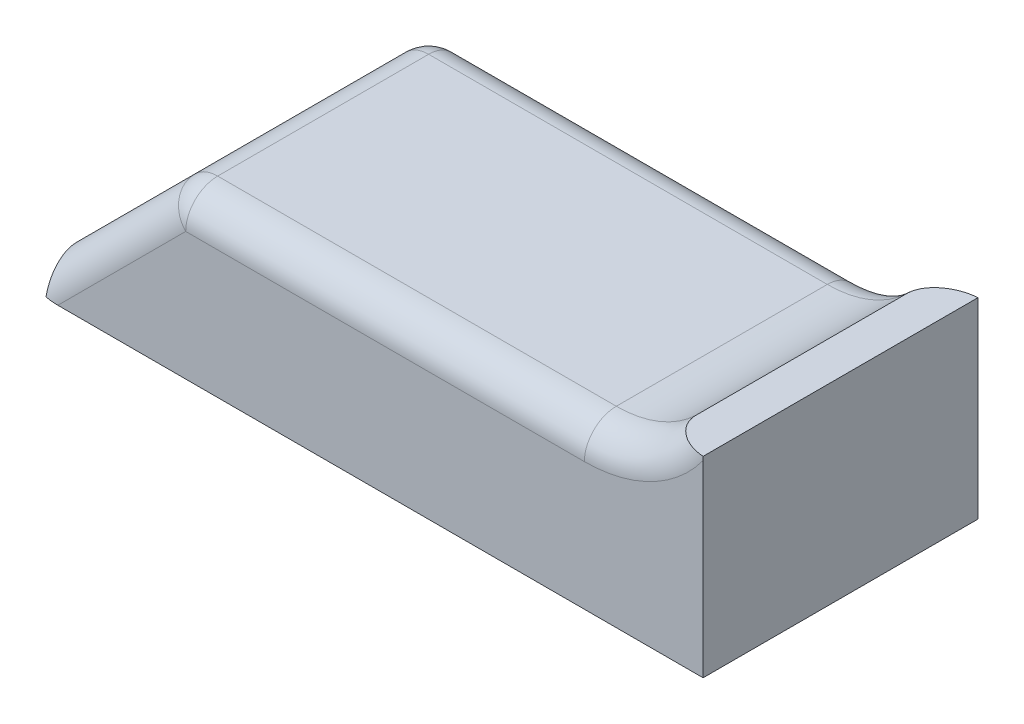
ISO-10303-21;
HEADER;
FILE_DESCRIPTION(('STEP AP214'),'2;1');
FILE_NAME('part.step','',(''),(''),'','','');
FILE_SCHEMA(('AUTOMOTIVE_DESIGN { 1 0 10303 214 1 1 1 1 }'));
ENDSEC;
DATA;
#1=APPLICATION_CONTEXT('core data for automotive mechanical design processes');
#2=APPLICATION_PROTOCOL_DEFINITION('international standard','automotive_design',2000,#1);
#3=PRODUCT_CONTEXT('',#1,'mechanical');
#4=PRODUCT('Part','Part','',(#3));
#5=PRODUCT_RELATED_PRODUCT_CATEGORY('part','',(#4));
#6=PRODUCT_DEFINITION_FORMATION('','',#4);
#7=PRODUCT_DEFINITION_CONTEXT('part definition',#1,'design');
#8=PRODUCT_DEFINITION('design','',#6,#7);
#9=PRODUCT_DEFINITION_SHAPE('','',#8);
#10=(LENGTH_UNIT() NAMED_UNIT(*) SI_UNIT(.MILLI.,.METRE.));
#11=(NAMED_UNIT(*) PLANE_ANGLE_UNIT() SI_UNIT($,.RADIAN.));
#12=(NAMED_UNIT(*) SI_UNIT($,.STERADIAN.) SOLID_ANGLE_UNIT());
#13=UNCERTAINTY_MEASURE_WITH_UNIT(LENGTH_MEASURE(1.E-05),#10,'distance_accuracy_value','');
#14=(GEOMETRIC_REPRESENTATION_CONTEXT(3) GLOBAL_UNCERTAINTY_ASSIGNED_CONTEXT((#13)) GLOBAL_UNIT_ASSIGNED_CONTEXT((#10,
#11,#12)) REPRESENTATION_CONTEXT('',''));
#15=CARTESIAN_POINT('',(0.,0.,0.));
#16=DIRECTION('',(0.,0.,1.));
#17=DIRECTION('',(1.,0.,0.));
#18=AXIS2_PLACEMENT_3D('',#15,#16,#17);
#19=CARTESIAN_POINT('',(0.,25.,0.));
#20=DIRECTION('',(0.,-1.,0.));
#21=DIRECTION('',(0.,0.,-1.));
#22=AXIS2_PLACEMENT_3D('',#19,#20,#21);
#23=PLANE('',#22);
#24=DIRECTION('',(0.,0.,-1.));
#25=VECTOR('',#24,1.);
#26=CARTESIAN_POINT('',(-29.4289321881345,25.,21.5));
#27=LINE('',#26,#25);
#28=CARTESIAN_POINT('',(-29.4289321881345,25.,-16.5));
#29=VERTEX_POINT('',#28);
#30=CARTESIAN_POINT('',(-29.4289321881345,25.,16.5));
#31=VERTEX_POINT('',#30);
#32=EDGE_CURVE('E323',#29,#31,#27,.F.);
#33=ORIENTED_EDGE('',*,*,#32,.T.);
#34=DIRECTION('',(1.,0.,0.));
#35=VECTOR('',#34,1.);
#36=CARTESIAN_POINT('',(0.,25.,16.5));
#37=LINE('',#36,#35);
#38=CARTESIAN_POINT('',(32.9266319976242,25.,16.5));
#39=VERTEX_POINT('',#38);
#40=EDGE_CURVE('E324',#31,#39,#37,.T.);
#41=ORIENTED_EDGE('',*,*,#40,.T.);
#42=DIRECTION('',(0.,0.,1.));
#43=VECTOR('',#42,1.);
#44=CARTESIAN_POINT('',(32.9266319976242,25.,0.));
#45=LINE('',#44,#43);
#46=CARTESIAN_POINT('',(32.9266319976242,25.,-16.5));
#47=VERTEX_POINT('',#46);
#48=EDGE_CURVE('E168',#39,#47,#45,.F.);
#49=ORIENTED_EDGE('',*,*,#48,.T.);
#50=DIRECTION('',(-1.,0.,0.));
#51=VECTOR('',#50,1.);
#52=CARTESIAN_POINT('',(0.,25.,-16.5));
#53=LINE('',#52,#51);
#54=EDGE_CURVE('E327',#47,#29,#53,.T.);
#55=ORIENTED_EDGE('',*,*,#54,.T.);
#56=EDGE_LOOP('',(#33,#41,#49,#55));
#57=FACE_BOUND('',#56,.T.);
#58=ADVANCED_FACE('F43',(#57),#23,.F.);
#59=CARTESIAN_POINT('',(-51.5,25.,-21.5));
#60=DIRECTION('',(1.,0.,0.));
#61=DIRECTION('',(0.,0.,-1.));
#62=AXIS2_PLACEMENT_3D('',#59,#60,#61);
#63=PLANE('',#62);
#64=DIRECTION('',(0.,0.,1.));
#65=VECTOR('',#64,1.);
#66=CARTESIAN_POINT('',(-51.5,0.,-21.5));
#67=LINE('',#66,#65);
#68=CARTESIAN_POINT('',(-51.5,0.,-21.2807257879246));
#69=VERTEX_POINT('',#68);
#70=CARTESIAN_POINT('',(-51.5,0.,21.2807257879246));
#71=VERTEX_POINT('',#70);
#72=EDGE_CURVE('E146',#69,#71,#67,.T.);
#73=ORIENTED_EDGE('',*,*,#72,.T.);
#74=CARTESIAN_POINT('',(-51.5,-2.07106781186554,16.5));
#75=DIRECTION('',(1.,0.,0.));
#76=DIRECTION('',(0.,-1.,0.));
#77=AXIS2_PLACEMENT_3D('',#74,#75,#76);
#78=ELLIPSE('',#77,7.07106781186549,5.);
#79=CARTESIAN_POINT('',(-51.5,4.99999999999993,16.5));
#80=VERTEX_POINT('',#79);
#81=EDGE_CURVE('E70',#71,#80,#78,.F.);
#82=ORIENTED_EDGE('',*,*,#81,.T.);
#83=DIRECTION('',(0.,0.,-1.));
#84=VECTOR('',#83,1.);
#85=CARTESIAN_POINT('',(-51.5,4.99999999999993,-21.5));
#86=LINE('',#85,#84);
#87=CARTESIAN_POINT('',(-51.5,4.99999999999993,-16.5));
#88=VERTEX_POINT('',#87);
#89=EDGE_CURVE('E158',#80,#88,#86,.T.);
#90=ORIENTED_EDGE('',*,*,#89,.T.);
#91=CARTESIAN_POINT('',(-51.5,-2.07106781186554,-16.5));
#92=DIRECTION('',(1.,0.,0.));
#93=DIRECTION('',(0.,1.,0.));
#94=AXIS2_PLACEMENT_3D('',#91,#92,#93);
#95=ELLIPSE('',#94,7.07106781186549,5.);
#96=EDGE_CURVE('E299',#88,#69,#95,.F.);
#97=ORIENTED_EDGE('',*,*,#96,.T.);
#98=EDGE_LOOP('',(#73,#82,#90,#97));
#99=FACE_BOUND('',#98,.T.);
#100=ADVANCED_FACE('F235',(#99),#63,.F.);
#101=CARTESIAN_POINT('',(51.5,25.,21.5));
#102=DIRECTION('',(0.,0.,-1.));
#103=DIRECTION('',(-1.,0.,0.));
#104=AXIS2_PLACEMENT_3D('',#101,#102,#103);
#105=PLANE('',#104);
#106=DIRECTION('',(1.,0.,0.));
#107=VECTOR('',#106,1.);
#108=CARTESIAN_POINT('',(51.5,20.,21.5));
#109=LINE('',#108,#107);
#110=CARTESIAN_POINT('',(32.9266319976242,20.,21.5));
#111=VERTEX_POINT('',#110);
#112=CARTESIAN_POINT('',(-29.4289321881345,20.,21.5));
#113=VERTEX_POINT('',#112);
#114=EDGE_CURVE('E171',#111,#113,#109,.F.);
#115=ORIENTED_EDGE('',*,*,#114,.T.);
#116=DIRECTION('',(0.707106781186546,0.707106781186549,0.));
#117=VECTOR('',#116,1.);
#118=CARTESIAN_POINT('',(-47.9644660940673,1.46446609406719,21.5));
#119=LINE('',#118,#117);
#120=CARTESIAN_POINT('',(-49.4289321881345,0.,21.5));
#121=VERTEX_POINT('',#120);
#122=EDGE_CURVE('E141',#113,#121,#119,.F.);
#123=ORIENTED_EDGE('',*,*,#122,.T.);
#124=DIRECTION('',(1.,0.,0.));
#125=VECTOR('',#124,1.);
#126=CARTESIAN_POINT('',(51.5,0.,21.5));
#127=LINE('',#126,#125);
#128=CARTESIAN_POINT('',(51.5,0.,21.5));
#129=VERTEX_POINT('',#128);
#130=EDGE_CURVE('E132',#121,#129,#127,.T.);
#131=ORIENTED_EDGE('',*,*,#130,.T.);
#132=DIRECTION('',(0.,-1.,0.));
#133=VECTOR('',#132,1.);
#134=CARTESIAN_POINT('',(51.5,25.,21.5));
#135=LINE('',#134,#133);
#136=CARTESIAN_POINT('',(51.5,29.4342342255101,21.5));
#137=VERTEX_POINT('',#136);
#138=EDGE_CURVE('E138',#137,#129,#135,.T.);
#139=ORIENTED_EDGE('',*,*,#138,.F.);
#140=CARTESIAN_POINT('',(32.9266319976242,43.,21.5));
#141=DIRECTION('',(0.,0.,-1.));
#142=DIRECTION('',(-1.,0.,0.));
#143=AXIS2_PLACEMENT_3D('',#140,#141,#142);
#144=CIRCLE('',#143,23.);
#145=EDGE_CURVE('E172',#137,#111,#144,.T.);
#146=ORIENTED_EDGE('',*,*,#145,.T.);
#147=EDGE_LOOP('',(#115,#123,#131,#139,#146));
#148=FACE_BOUND('',#147,.T.);
#149=ADVANCED_FACE('F139',(#148),#105,.F.);
#150=CARTESIAN_POINT('',(51.5,25.,-21.5));
#151=DIRECTION('',(-1.,0.,0.));
#152=DIRECTION('',(0.,0.,1.));
#153=AXIS2_PLACEMENT_3D('',#150,#151,#152);
#154=PLANE('',#153);
#155=DIRECTION('',(0.,0.,-1.));
#156=VECTOR('',#155,1.);
#157=CARTESIAN_POINT('',(51.5,30.,21.5));
#158=LINE('',#157,#156);
#159=CARTESIAN_POINT('',(51.5,30.,21.4891579881584));
#160=VERTEX_POINT('',#159);
#161=CARTESIAN_POINT('',(51.5,30.,-21.4891579881584));
#162=VERTEX_POINT('',#161);
#163=EDGE_CURVE('E314',#160,#162,#158,.T.);
#164=ORIENTED_EDGE('',*,*,#163,.F.);
#165=CARTESIAN_POINT('',(51.5,30.,21.4891579881584));
#166=CARTESIAN_POINT('',(51.5,29.9057399798548,21.4927472598727));
#167=CARTESIAN_POINT('',(51.5,29.8114628824993,21.4954453967008));
#168=CARTESIAN_POINT('',(51.5,29.6228742910905,21.4990594052273));
#169=CARTESIAN_POINT('',(51.5,29.5285627969493,21.4999752723464));
#170=CARTESIAN_POINT('',(51.5,29.4342342255101,21.5));
#171=B_SPLINE_CURVE_WITH_KNOTS('',3,(#165,#166,#167,#168,#169,#170),.UNSPECIFIED.,.F.,.F.,(4,2,
4),(0.,0.282947096208946,0.565894919415669),.UNSPECIFIED.);
#172=EDGE_CURVE('E160',#160,#137,#171,.T.);
#173=ORIENTED_EDGE('',*,*,#172,.T.);
#174=ORIENTED_EDGE('',*,*,#138,.T.);
#175=DIRECTION('',(0.,0.,-1.));
#176=VECTOR('',#175,1.);
#177=CARTESIAN_POINT('',(51.5,0.,-21.5));
#178=LINE('',#177,#176);
#179=CARTESIAN_POINT('',(51.5,0.,-21.5));
#180=VERTEX_POINT('',#179);
#181=EDGE_CURVE('E150',#129,#180,#178,.T.);
#182=ORIENTED_EDGE('',*,*,#181,.T.);
#183=DIRECTION('',(0.,-1.,0.));
#184=VECTOR('',#183,1.);
#185=CARTESIAN_POINT('',(51.5,25.,-21.5));
#186=LINE('',#185,#184);
#187=CARTESIAN_POINT('',(51.5,29.4342342255101,-21.5));
#188=VERTEX_POINT('',#187);
#189=EDGE_CURVE('E157',#188,#180,#186,.T.);
#190=ORIENTED_EDGE('',*,*,#189,.F.);
#191=CARTESIAN_POINT('',(51.5,29.4342342255101,-21.5));
#192=CARTESIAN_POINT('',(51.5,29.5285627969493,-21.4999752723464));
#193=CARTESIAN_POINT('',(51.5,29.6228742910905,-21.4990594052273));
#194=CARTESIAN_POINT('',(51.5,29.8114628824993,-21.4954453967008));
#195=CARTESIAN_POINT('',(51.5,29.9057399798548,-21.4927472598727));
#196=CARTESIAN_POINT('',(51.5,30.,-21.4891579881584));
#197=B_SPLINE_CURVE_WITH_KNOTS('',3,(#191,#192,#193,#194,#195,#196),.UNSPECIFIED.,.F.,.F.,(4,2,
4),(0.,0.282947823206724,0.565894919415669),.UNSPECIFIED.);
#198=EDGE_CURVE('E211',#188,#162,#197,.T.);
#199=ORIENTED_EDGE('',*,*,#198,.T.);
#200=EDGE_LOOP('',(#164,#173,#174,#182,#190,#199));
#201=FACE_BOUND('',#200,.T.);
#202=ADVANCED_FACE('F153',(#201),#154,.F.);
#203=CARTESIAN_POINT('',(51.5,25.,-21.5));
#204=DIRECTION('',(0.,0.,1.));
#205=DIRECTION('',(1.,0.,0.));
#206=AXIS2_PLACEMENT_3D('',#203,#204,#205);
#207=PLANE('',#206);
#208=DIRECTION('',(-1.,0.,0.));
#209=VECTOR('',#208,1.);
#210=CARTESIAN_POINT('',(51.5,0.,-21.5));
#211=LINE('',#210,#209);
#212=CARTESIAN_POINT('',(-49.4289321881345,0.,-21.5));
#213=VERTEX_POINT('',#212);
#214=EDGE_CURVE('E162',#180,#213,#211,.T.);
#215=ORIENTED_EDGE('',*,*,#214,.T.);
#216=DIRECTION('',(-0.707106781186546,-0.707106781186549,0.));
#217=VECTOR('',#216,1.);
#218=CARTESIAN_POINT('',(-32.9644660940672,16.4644660940673,-21.5));
#219=LINE('',#218,#217);
#220=CARTESIAN_POINT('',(-29.4289321881345,20.,-21.5));
#221=VERTEX_POINT('',#220);
#222=EDGE_CURVE('E11',#213,#221,#219,.F.);
#223=ORIENTED_EDGE('',*,*,#222,.T.);
#224=DIRECTION('',(-1.,0.,0.));
#225=VECTOR('',#224,1.);
#226=CARTESIAN_POINT('',(51.5,20.,-21.5));
#227=LINE('',#226,#225);
#228=CARTESIAN_POINT('',(32.9266319976242,20.,-21.5));
#229=VERTEX_POINT('',#228);
#230=EDGE_CURVE('E334',#221,#229,#227,.F.);
#231=ORIENTED_EDGE('',*,*,#230,.T.);
#232=CARTESIAN_POINT('',(32.9266319976242,43.,-21.5));
#233=DIRECTION('',(0.,0.,1.));
#234=DIRECTION('',(1.,0.,0.));
#235=AXIS2_PLACEMENT_3D('',#232,#233,#234);
#236=CIRCLE('',#235,23.);
#237=EDGE_CURVE('E335',#229,#188,#236,.T.);
#238=ORIENTED_EDGE('',*,*,#237,.T.);
#239=ORIENTED_EDGE('',*,*,#189,.T.);
#240=EDGE_LOOP('',(#215,#223,#231,#238,#239));
#241=FACE_BOUND('',#240,.T.);
#242=ADVANCED_FACE('F230',(#241),#207,.F.);
#243=CARTESIAN_POINT('',(0.,0.,0.));
#244=DIRECTION('',(0.,-1.,0.));
#245=DIRECTION('',(0.,0.,-1.));
#246=AXIS2_PLACEMENT_3D('',#243,#244,#245);
#247=PLANE('',#246);
#248=ORIENTED_EDGE('',*,*,#130,.F.);
#249=CARTESIAN_POINT('',(-49.4289321881345,0.,16.5));
#250=DIRECTION('',(0.,-1.,0.));
#251=DIRECTION('',(-1.,0.,0.));
#252=AXIS2_PLACEMENT_3D('',#249,#250,#251);
#253=ELLIPSE('',#252,7.07106781186546,5.);
#254=EDGE_CURVE('E300',#121,#71,#253,.T.);
#255=ORIENTED_EDGE('',*,*,#254,.T.);
#256=ORIENTED_EDGE('',*,*,#72,.F.);
#257=CARTESIAN_POINT('',(-49.4289321881345,0.,-16.5));
#258=DIRECTION('',(0.,-1.,0.));
#259=DIRECTION('',(1.,0.,0.));
#260=AXIS2_PLACEMENT_3D('',#257,#258,#259);
#261=ELLIPSE('',#260,7.07106781186546,5.);
#262=EDGE_CURVE('E276',#69,#213,#261,.T.);
#263=ORIENTED_EDGE('',*,*,#262,.T.);
#264=ORIENTED_EDGE('',*,*,#214,.F.);
#265=ORIENTED_EDGE('',*,*,#181,.F.);
#266=EDGE_LOOP('',(#248,#255,#256,#263,#264,#265));
#267=FACE_BOUND('',#266,.T.);
#268=ADVANCED_FACE('F161',(#267),#247,.T.);
#269=CARTESIAN_POINT('',(-31.5,25.,0.));
#270=DIRECTION('',(0.707106781186549,-0.707106781186546,0.));
#271=DIRECTION('',(0.,0.,1.));
#272=AXIS2_PLACEMENT_3D('',#269,#270,#271);
#273=PLANE('',#272);
#274=ORIENTED_EDGE('',*,*,#89,.F.);
#275=DIRECTION('',(-0.707106781186546,-0.707106781186549,0.));
#276=VECTOR('',#275,1.);
#277=CARTESIAN_POINT('',(-36.5,20.,16.5));
#278=LINE('',#277,#276);
#279=CARTESIAN_POINT('',(-32.9644660940673,23.5355339059327,16.5));
#280=VERTEX_POINT('',#279);
#281=EDGE_CURVE('E55',#80,#280,#278,.F.);
#282=ORIENTED_EDGE('',*,*,#281,.T.);
#283=DIRECTION('',(0.,0.,1.));
#284=VECTOR('',#283,1.);
#285=CARTESIAN_POINT('',(-32.9644660940673,23.5355339059327,-21.5));
#286=LINE('',#285,#284);
#287=CARTESIAN_POINT('',(-32.9644660940673,23.5355339059327,-16.5));
#288=VERTEX_POINT('',#287);
#289=EDGE_CURVE('E320',#280,#288,#286,.F.);
#290=ORIENTED_EDGE('',*,*,#289,.T.);
#291=DIRECTION('',(0.707106781186546,0.707106781186549,0.));
#292=VECTOR('',#291,1.);
#293=CARTESIAN_POINT('',(-51.5,4.99999999999991,-16.5));
#294=LINE('',#293,#292);
#295=EDGE_CURVE('E58',#288,#88,#294,.F.);
#296=ORIENTED_EDGE('',*,*,#295,.T.);
#297=EDGE_LOOP('',(#274,#282,#290,#296));
#298=FACE_BOUND('',#297,.T.);
#299=ADVANCED_FACE('F237',(#298),#273,.F.);
#300=CARTESIAN_POINT('',(0.,30.,0.));
#301=DIRECTION('',(0.,1.,0.));
#302=DIRECTION('',(0.,0.,1.));
#303=AXIS2_PLACEMENT_3D('',#300,#301,#302);
#304=PLANE('',#303);
#305=DIRECTION('',(0.,0.,1.));
#306=VECTOR('',#305,1.);
#307=CARTESIAN_POINT('',(45.3765315956129,30.,21.5));
#308=LINE('',#307,#306);
#309=CARTESIAN_POINT('',(45.3765315956129,30.,-16.5));
#310=VERTEX_POINT('',#309);
#311=CARTESIAN_POINT('',(45.3765315956129,30.,16.5));
#312=VERTEX_POINT('',#311);
#313=EDGE_CURVE('E458',#310,#312,#308,.T.);
#314=ORIENTED_EDGE('',*,*,#313,.T.);
#315=CARTESIAN_POINT('',(45.3765315956129,30.,16.5));
#316=CARTESIAN_POINT('',(45.3764793175411,30.,16.6134061847709));
#317=CARTESIAN_POINT('',(45.38210804955,30.,16.7267819813948));
#318=CARTESIAN_POINT('',(45.404321984002,30.,16.9523346318892));
#319=CARTESIAN_POINT('',(45.4208952028498,30.,17.0645126608854));
#320=CARTESIAN_POINT('',(45.4643700367629,30.,17.2856438974703));
#321=CARTESIAN_POINT('',(45.4911639543115,30.,17.3946183815912));
#322=CARTESIAN_POINT('',(45.5543991489936,30.,17.6097178190154));
#323=CARTESIAN_POINT('',(45.5908425473341,30.,17.715842140122));
#324=CARTESIAN_POINT('',(45.713137350681,30.,18.0280200965836));
#325=CARTESIAN_POINT('',(45.8121896447062,30.,18.2290161929387));
#326=CARTESIAN_POINT('',(46.0389972165031,30.,18.6143841805319));
#327=CARTESIAN_POINT('',(46.1668367949908,30.,18.7987049714408));
#328=CARTESIAN_POINT('',(46.5121077942566,30.,19.2335913084696));
#329=CARTESIAN_POINT('',(46.7430880986463,30.,19.4734836136231));
#330=CARTESIAN_POINT('',(47.1156158093794,30.,19.803135966972));
#331=CARTESIAN_POINT('',(47.2443331484583,30.,19.9081147962429));
#332=CARTESIAN_POINT('',(47.5093042878958,30.,20.1081617047338));
#333=CARTESIAN_POINT('',(47.6455578779214,30.,20.2032300603367));
#334=CARTESIAN_POINT('',(47.9621644387974,30.,20.4078436078213));
#335=CARTESIAN_POINT('',(48.1444815022262,30.,20.5143547494608));
#336=CARTESIAN_POINT('',(48.5175039972707,30.,20.7114328803978));
#337=CARTESIAN_POINT('',(48.7082121236523,30.,20.8019947002115));
#338=CARTESIAN_POINT('',(49.2902229317951,30.,21.0494256516608));
#339=CARTESIAN_POINT('',(49.6920661316307,30.,21.182456004743));
#340=CARTESIAN_POINT('',(50.3311640751279,30.,21.3380299410222));
#341=CARTESIAN_POINT('',(50.5631920618638,30.,21.3834382120554));
#342=CARTESIAN_POINT('',(51.029887709596,30.,21.4525947451447));
#343=CARTESIAN_POINT('',(51.2645478354005,30.,21.4763939480233));
#344=CARTESIAN_POINT('',(51.5,30.,21.4891579881584));
#345=B_SPLINE_CURVE_WITH_KNOTS('',3,(#315,#316,#317,#318,#319,#320,#321,#322,#323,#324,#325,
#326,#327,#328,#329,#330,#331,#332,#333,#334,#335,#336,#337,#338,#339,#340,#341,#342,#343,#344),
.UNSPECIFIED.,.F.,.F.,(4,2,2,2,2,2,2,2,2,2,2,2,2,2,4),(0.,0.340029807671386,0.679687917853081,
1.01586165960251,1.35210936253202,2.02116633618007,2.69220866195324,3.68537078065545,
4.18334823134932,4.68131179074924,5.31389171022003,5.94667628525116,7.20994765409705,
7.91839155323834,8.62516101060927),.UNSPECIFIED.);
#346=EDGE_CURVE('E189',#312,#160,#345,.T.);
#347=ORIENTED_EDGE('',*,*,#346,.T.);
#348=ORIENTED_EDGE('',*,*,#163,.T.);
#349=CARTESIAN_POINT('',(51.5,30.,-21.4891579881584));
#350=CARTESIAN_POINT('',(51.2889302240343,30.,-21.4777406962776));
#351=CARTESIAN_POINT('',(51.0783737975366,30.,-21.4574078637806));
#352=CARTESIAN_POINT('',(50.6596717728972,30.,-21.399412494096));
#353=CARTESIAN_POINT('',(50.4515260094364,30.,-21.3617511525684));
#354=CARTESIAN_POINT('',(50.0373498666069,30.,-21.2692298243104));
#355=CARTESIAN_POINT('',(49.8313497308049,30.,-21.214234661289));
#356=CARTESIAN_POINT('',(49.4245442175918,30.,-21.0875402880589));
#357=CARTESIAN_POINT('',(49.2237389762197,30.,-21.0158406408998));
#358=CARTESIAN_POINT('',(48.8246094610552,30.,-20.8543376370923));
#359=CARTESIAN_POINT('',(48.6264259351618,30.,-20.7641855942541));
#360=CARTESIAN_POINT('',(48.2386322723098,30.,-20.5668927416743));
#361=CARTESIAN_POINT('',(48.0490238366128,30.,-20.4597485796052));
#362=CARTESIAN_POINT('',(47.6809615283949,30.,-20.228818197794));
#363=CARTESIAN_POINT('',(47.5024760894918,30.,-20.1050825393861));
#364=CARTESIAN_POINT('',(47.1586449545068,30.,-19.840704129947));
#365=CARTESIAN_POINT('',(46.9932907364696,30.,-19.7000724955646));
#366=CARTESIAN_POINT('',(46.6435175516365,30.,-19.3682730075136));
#367=CARTESIAN_POINT('',(46.4630848863056,30.,-19.1728323621523));
#368=CARTESIAN_POINT('',(46.1342801944338,30.,-18.7566662992155));
#369=CARTESIAN_POINT('',(45.9858622064922,30.,-18.5359778348476));
#370=CARTESIAN_POINT('',(45.7551359166684,30.,-18.1151660504671));
#371=CARTESIAN_POINT('',(45.6656322445606,30.,-17.9190535015549));
#372=CARTESIAN_POINT('',(45.5566740937969,30.,-17.6161019106209));
#373=CARTESIAN_POINT('',(45.5245827750688,30.,-17.5137191583177));
#374=CARTESIAN_POINT('',(45.4694209920505,30.,-17.3065679580862));
#375=CARTESIAN_POINT('',(45.4463465040849,30.,-17.2018005964052));
#376=CARTESIAN_POINT('',(45.4110096390521,30.,-16.9978326255478));
#377=CARTESIAN_POINT('',(45.3981158382755,30.,-16.8987412171072));
#378=CARTESIAN_POINT('',(45.3808591688201,30.,-16.6997734498099));
#379=CARTESIAN_POINT('',(45.3765003512542,30.,-16.5998967407818));
#380=CARTESIAN_POINT('',(45.3765315956129,30.,-16.5));
#381=B_SPLINE_CURVE_WITH_KNOTS('',3,(#349,#350,#351,#352,#353,#354,#355,#356,#357,#358,#359,
#360,#361,#362,#363,#364,#365,#366,#367,#368,#369,#370,#371,#372,#373,#374,#375,#376,#377,#378,
#379,#380),.UNSPECIFIED.,.F.,.F.,(4,2,2,2,2,2,2,2,2,2,2,2,2,2,2,4),(0.,0.633902024751119,
1.26776031708144,1.90668937855341,2.5456351547996,3.19800420456236,3.85050211885849,
4.50105496562203,5.15118210359894,5.94646388734891,6.74059622351274,7.38445612881485,
7.7059953644552,8.02739095195588,8.32681018836514,8.62637150910088),.UNSPECIFIED.);
#382=EDGE_CURVE('E182',#162,#310,#381,.T.);
#383=ORIENTED_EDGE('',*,*,#382,.T.);
#384=EDGE_LOOP('',(#314,#347,#348,#383));
#385=FACE_BOUND('',#384,.T.);
#386=ADVANCED_FACE('F198',(#385),#304,.T.);
#387=CARTESIAN_POINT('',(32.9266319976242,43.,21.5));
#388=DIRECTION('',(0.,0.,1.));
#389=DIRECTION('',(1.,0.,0.));
#390=AXIS2_PLACEMENT_3D('',#387,#388,#389);
#391=CYLINDRICAL_SURFACE('',#390,18.);
#392=ORIENTED_EDGE('',*,*,#48,.F.);
#393=CARTESIAN_POINT('',(32.9266319976242,43.,16.5));
#394=DIRECTION('',(0.,0.,-1.));
#395=DIRECTION('',(-1.,0.,0.));
#396=AXIS2_PLACEMENT_3D('',#393,#394,#395);
#397=CIRCLE('',#396,18.);
#398=EDGE_CURVE('E176',#39,#312,#397,.F.);
#399=ORIENTED_EDGE('',*,*,#398,.T.);
#400=ORIENTED_EDGE('',*,*,#313,.F.);
#401=CARTESIAN_POINT('',(32.9266319976242,43.,-16.5));
#402=DIRECTION('',(0.,0.,1.));
#403=DIRECTION('',(1.,0.,0.));
#404=AXIS2_PLACEMENT_3D('',#401,#402,#403);
#405=CIRCLE('',#404,18.);
#406=EDGE_CURVE('E180',#310,#47,#405,.F.);
#407=ORIENTED_EDGE('',*,*,#406,.T.);
#408=EDGE_LOOP('',(#392,#399,#400,#407));
#409=FACE_BOUND('',#408,.T.);
#410=ADVANCED_FACE('F202',(#409),#391,.F.);
#411=CARTESIAN_POINT('',(32.9266319976242,43.,-16.5));
#412=DIRECTION('',(0.,0.,1.));
#413=DIRECTION('',(1.,0.,0.));
#414=AXIS2_PLACEMENT_3D('',#411,#412,#413);
#415=TOROIDAL_SURFACE('',#414,23.,5.);
#416=ORIENTED_EDGE('',*,*,#198,.F.);
#417=ORIENTED_EDGE('',*,*,#237,.F.);
#418=CARTESIAN_POINT('',(32.9266319976242,20.,-16.5));
#419=DIRECTION('',(-1.,0.,0.));
#420=DIRECTION('',(0.,0.,1.));
#421=AXIS2_PLACEMENT_3D('',#418,#419,#420);
#422=CIRCLE('',#421,5.);
#423=EDGE_CURVE('E306',#47,#229,#422,.T.);
#424=ORIENTED_EDGE('',*,*,#423,.F.);
#425=ORIENTED_EDGE('',*,*,#406,.F.);
#426=ORIENTED_EDGE('',*,*,#382,.F.);
#427=EDGE_LOOP('',(#416,#417,#424,#425,#426));
#428=FACE_BOUND('',#427,.T.);
#429=ADVANCED_FACE('F200',(#428),#415,.T.);
#430=CARTESIAN_POINT('',(0.,20.,-16.5));
#431=DIRECTION('',(-1.,0.,0.));
#432=DIRECTION('',(0.,0.,1.));
#433=AXIS2_PLACEMENT_3D('',#430,#431,#432);
#434=CYLINDRICAL_SURFACE('',#433,5.);
#435=ORIENTED_EDGE('',*,*,#230,.F.);
#436=CARTESIAN_POINT('',(-29.4289321881345,20.,-16.5));
#437=DIRECTION('',(-1.,0.,0.));
#438=DIRECTION('',(0.,0.,1.));
#439=AXIS2_PLACEMENT_3D('',#436,#437,#438);
#440=CIRCLE('',#439,5.);
#441=EDGE_CURVE('E282',#221,#29,#440,.F.);
#442=ORIENTED_EDGE('',*,*,#441,.T.);
#443=ORIENTED_EDGE('',*,*,#54,.F.);
#444=ORIENTED_EDGE('',*,*,#423,.T.);
#445=EDGE_LOOP('',(#435,#442,#443,#444));
#446=FACE_BOUND('',#445,.T.);
#447=ADVANCED_FACE('F204',(#446),#434,.T.);
#448=CARTESIAN_POINT('',(-29.4289321881345,20.,0.));
#449=DIRECTION('',(0.,0.,1.));
#450=DIRECTION('',(1.,0.,0.));
#451=AXIS2_PLACEMENT_3D('',#448,#449,#450);
#452=CYLINDRICAL_SURFACE('',#451,5.);
#453=ORIENTED_EDGE('',*,*,#289,.F.);
#454=CARTESIAN_POINT('',(-29.4289321881345,20.,16.5));
#455=DIRECTION('',(0.,0.,1.));
#456=DIRECTION('',(1.,0.,0.));
#457=AXIS2_PLACEMENT_3D('',#454,#455,#456);
#458=CIRCLE('',#457,5.);
#459=EDGE_CURVE('E288',#280,#31,#458,.F.);
#460=ORIENTED_EDGE('',*,*,#459,.T.);
#461=ORIENTED_EDGE('',*,*,#32,.F.);
#462=CARTESIAN_POINT('',(-29.4289321881345,20.,-16.5));
#463=DIRECTION('',(0.,0.,1.));
#464=DIRECTION('',(1.,0.,0.));
#465=AXIS2_PLACEMENT_3D('',#462,#463,#464);
#466=CIRCLE('',#465,5.);
#467=EDGE_CURVE('E290',#29,#288,#466,.T.);
#468=ORIENTED_EDGE('',*,*,#467,.T.);
#469=EDGE_LOOP('',(#453,#460,#461,#468));
#470=FACE_BOUND('',#469,.T.);
#471=ADVANCED_FACE('F252',(#470),#452,.T.);
#472=CARTESIAN_POINT('',(0.,20.,16.5));
#473=DIRECTION('',(1.,0.,0.));
#474=DIRECTION('',(0.,0.,-1.));
#475=AXIS2_PLACEMENT_3D('',#472,#473,#474);
#476=CYLINDRICAL_SURFACE('',#475,5.);
#477=ORIENTED_EDGE('',*,*,#40,.F.);
#478=CARTESIAN_POINT('',(-29.4289321881345,20.,16.5));
#479=DIRECTION('',(1.,0.,0.));
#480=DIRECTION('',(0.,0.,-1.));
#481=AXIS2_PLACEMENT_3D('',#478,#479,#480);
#482=CIRCLE('',#481,5.);
#483=EDGE_CURVE('E319',#31,#113,#482,.T.);
#484=ORIENTED_EDGE('',*,*,#483,.T.);
#485=ORIENTED_EDGE('',*,*,#114,.F.);
#486=CARTESIAN_POINT('',(32.9266319976242,20.,16.5));
#487=DIRECTION('',(1.,0.,0.));
#488=DIRECTION('',(0.,0.,-1.));
#489=AXIS2_PLACEMENT_3D('',#486,#487,#488);
#490=CIRCLE('',#489,5.);
#491=EDGE_CURVE('E304',#39,#111,#490,.T.);
#492=ORIENTED_EDGE('',*,*,#491,.F.);
#493=EDGE_LOOP('',(#477,#484,#485,#492));
#494=FACE_BOUND('',#493,.T.);
#495=ADVANCED_FACE('F249',(#494),#476,.T.);
#496=CARTESIAN_POINT('',(32.9266319976242,43.,16.5));
#497=DIRECTION('',(0.,0.,-1.));
#498=DIRECTION('',(-1.,0.,0.));
#499=AXIS2_PLACEMENT_3D('',#496,#497,#498);
#500=TOROIDAL_SURFACE('',#499,23.,5.);
#501=ORIENTED_EDGE('',*,*,#346,.F.);
#502=ORIENTED_EDGE('',*,*,#398,.F.);
#503=ORIENTED_EDGE('',*,*,#491,.T.);
#504=ORIENTED_EDGE('',*,*,#145,.F.);
#505=ORIENTED_EDGE('',*,*,#172,.F.);
#506=EDGE_LOOP('',(#501,#502,#503,#504,#505));
#507=FACE_BOUND('',#506,.T.);
#508=ADVANCED_FACE('F241',(#507),#500,.T.);
#509=CARTESIAN_POINT('',(13.5355339059326,62.9644660940673,16.5));
#510=DIRECTION('',(-0.707106781186546,-0.707106781186549,0.));
#511=DIRECTION('',(0.707106781186549,-0.707106781186546,0.));
#512=AXIS2_PLACEMENT_3D('',#509,#510,#511);
#513=CYLINDRICAL_SURFACE('',#512,5.);
#514=CARTESIAN_POINT('',(-29.4289321881345,20.,16.5));
#515=DIRECTION('',(0.707106781186546,0.707106781186549,0.));
#516=DIRECTION('',(-0.707106781186549,0.707106781186546,0.));
#517=AXIS2_PLACEMENT_3D('',#514,#515,#516);
#518=CIRCLE('',#517,5.);
#519=EDGE_CURVE('E284',#280,#113,#518,.T.);
#520=ORIENTED_EDGE('',*,*,#519,.F.);
#521=ORIENTED_EDGE('',*,*,#281,.F.);
#522=ORIENTED_EDGE('',*,*,#81,.F.);
#523=ORIENTED_EDGE('',*,*,#254,.F.);
#524=ORIENTED_EDGE('',*,*,#122,.F.);
#525=EDGE_LOOP('',(#520,#521,#522,#523,#524));
#526=FACE_BOUND('',#525,.T.);
#527=ADVANCED_FACE('F250',(#526),#513,.T.);
#528=CARTESIAN_POINT('',(-29.4289321881345,20.,16.5));
#529=DIRECTION('',(0.,0.,1.));
#530=DIRECTION('',(1.,0.,0.));
#531=AXIS2_PLACEMENT_3D('',#528,#529,#530);
#532=SPHERICAL_SURFACE('',#531,5.);
#533=ORIENTED_EDGE('',*,*,#483,.F.);
#534=ORIENTED_EDGE('',*,*,#459,.F.);
#535=ORIENTED_EDGE('',*,*,#519,.T.);
#536=EDGE_LOOP('',(#533,#534,#535));
#537=FACE_BOUND('',#536,.T.);
#538=ADVANCED_FACE('F208',(#537),#532,.T.);
#539=CARTESIAN_POINT('',(13.5355339059326,62.9644660940673,-16.5));
#540=DIRECTION('',(0.707106781186546,0.707106781186549,0.));
#541=DIRECTION('',(-0.707106781186549,0.707106781186546,0.));
#542=AXIS2_PLACEMENT_3D('',#539,#540,#541);
#543=CYLINDRICAL_SURFACE('',#542,5.);
#544=CARTESIAN_POINT('',(-29.4289321881345,20.,-16.5));
#545=DIRECTION('',(0.707106781186546,0.707106781186549,0.));
#546=DIRECTION('',(-0.707106781186549,0.707106781186546,0.));
#547=AXIS2_PLACEMENT_3D('',#544,#545,#546);
#548=CIRCLE('',#547,5.);
#549=EDGE_CURVE('E50',#221,#288,#548,.T.);
#550=ORIENTED_EDGE('',*,*,#549,.F.);
#551=ORIENTED_EDGE('',*,*,#222,.F.);
#552=ORIENTED_EDGE('',*,*,#262,.F.);
#553=ORIENTED_EDGE('',*,*,#96,.F.);
#554=ORIENTED_EDGE('',*,*,#295,.F.);
#555=EDGE_LOOP('',(#550,#551,#552,#553,#554));
#556=FACE_BOUND('',#555,.T.);
#557=ADVANCED_FACE('F44',(#556),#543,.T.);
#558=CARTESIAN_POINT('',(-29.4289321881345,20.,-16.5));
#559=DIRECTION('',(0.,0.,1.));
#560=DIRECTION('',(1.,0.,0.));
#561=AXIS2_PLACEMENT_3D('',#558,#559,#560);
#562=SPHERICAL_SURFACE('',#561,5.);
#563=ORIENTED_EDGE('',*,*,#467,.F.);
#564=ORIENTED_EDGE('',*,*,#441,.F.);
#565=ORIENTED_EDGE('',*,*,#549,.T.);
#566=EDGE_LOOP('',(#563,#564,#565));
#567=FACE_BOUND('',#566,.T.);
#568=ADVANCED_FACE('F287',(#567),#562,.T.);
#569=CLOSED_SHELL('',(#58,#100,#149,#202,#242,#268,#299,#386,#410,#429,#447,#471,#495,#508,#527,
#538,#557,#568));
#570=MANIFOLD_SOLID_BREP('B2',#569);
#571=ADVANCED_BREP_SHAPE_REPRESENTATION('',(#18,#570),#14);
#572=SHAPE_DEFINITION_REPRESENTATION(#9,#571);
ENDSEC;
END-ISO-10303-21;
